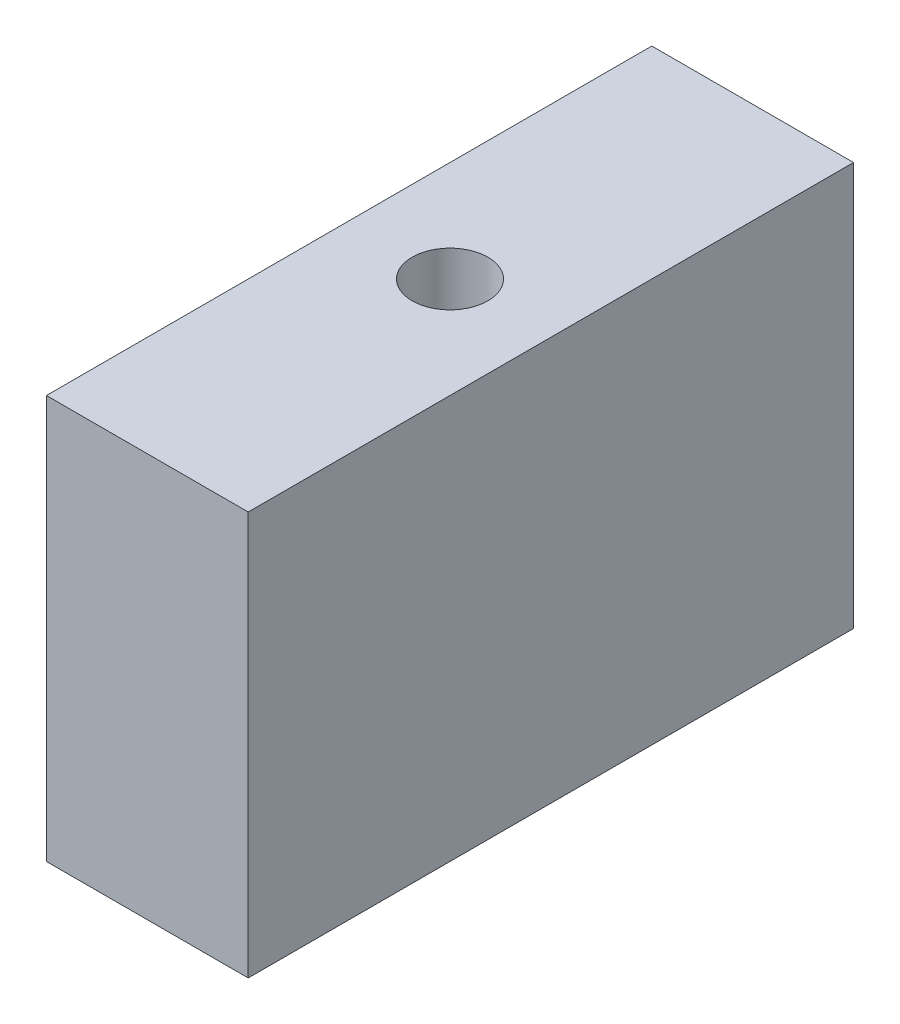
ISO-10303-21;
HEADER;
FILE_DESCRIPTION(('STEP AP214'),'2;1');
FILE_NAME('part.step','',(''),(''),'','','');
FILE_SCHEMA(('AUTOMOTIVE_DESIGN { 1 0 10303 214 1 1 1 1 }'));
ENDSEC;
DATA;
#1=APPLICATION_CONTEXT('core data for automotive mechanical design processes');
#2=APPLICATION_PROTOCOL_DEFINITION('international standard','automotive_design',2000,#1);
#3=PRODUCT_CONTEXT('',#1,'mechanical');
#4=PRODUCT('Part','Part','',(#3));
#5=PRODUCT_RELATED_PRODUCT_CATEGORY('part','',(#4));
#6=PRODUCT_DEFINITION_FORMATION('','',#4);
#7=PRODUCT_DEFINITION_CONTEXT('part definition',#1,'design');
#8=PRODUCT_DEFINITION('design','',#6,#7);
#9=PRODUCT_DEFINITION_SHAPE('','',#8);
#10=(LENGTH_UNIT() NAMED_UNIT(*) SI_UNIT(.MILLI.,.METRE.));
#11=(NAMED_UNIT(*) PLANE_ANGLE_UNIT() SI_UNIT($,.RADIAN.));
#12=(NAMED_UNIT(*) SI_UNIT($,.STERADIAN.) SOLID_ANGLE_UNIT());
#13=UNCERTAINTY_MEASURE_WITH_UNIT(LENGTH_MEASURE(1.E-05),#10,'distance_accuracy_value','');
#14=(GEOMETRIC_REPRESENTATION_CONTEXT(3) GLOBAL_UNCERTAINTY_ASSIGNED_CONTEXT((#13)) GLOBAL_UNIT_ASSIGNED_CONTEXT((#10,
#11,#12)) REPRESENTATION_CONTEXT('',''));
#15=CARTESIAN_POINT('',(0.,0.,0.));
#16=DIRECTION('',(0.,0.,1.));
#17=DIRECTION('',(1.,0.,0.));
#18=AXIS2_PLACEMENT_3D('',#15,#16,#17);
#19=CARTESIAN_POINT('',(1.5875,6.35,4.7625));
#20=DIRECTION('',(-1.,0.,0.));
#21=DIRECTION('',(0.,0.,1.));
#22=AXIS2_PLACEMENT_3D('',#19,#20,#21);
#23=PLANE('',#22);
#24=DIRECTION('',(0.,0.,-1.));
#25=VECTOR('',#24,1.);
#26=CARTESIAN_POINT('',(1.5875,0.,4.7625));
#27=LINE('',#26,#25);
#28=CARTESIAN_POINT('',(1.5875,0.,4.7625));
#29=VERTEX_POINT('',#28);
#30=CARTESIAN_POINT('',(1.5875,0.,-4.7625));
#31=VERTEX_POINT('',#30);
#32=EDGE_CURVE('E97',#29,#31,#27,.T.);
#33=ORIENTED_EDGE('',*,*,#32,.T.);
#34=DIRECTION('',(0.,-1.,0.));
#35=VECTOR('',#34,1.);
#36=CARTESIAN_POINT('',(1.5875,6.35,-4.7625));
#37=LINE('',#36,#35);
#38=CARTESIAN_POINT('',(1.5875,6.35,-4.7625));
#39=VERTEX_POINT('',#38);
#40=EDGE_CURVE('E11',#39,#31,#37,.T.);
#41=ORIENTED_EDGE('',*,*,#40,.F.);
#42=DIRECTION('',(0.,0.,-1.));
#43=VECTOR('',#42,1.);
#44=CARTESIAN_POINT('',(1.5875,6.35,4.7625));
#45=LINE('',#44,#43);
#46=CARTESIAN_POINT('',(1.5875,6.35,4.7625));
#47=VERTEX_POINT('',#46);
#48=EDGE_CURVE('E85',#47,#39,#45,.T.);
#49=ORIENTED_EDGE('',*,*,#48,.F.);
#50=DIRECTION('',(0.,-1.,0.));
#51=VECTOR('',#50,1.);
#52=CARTESIAN_POINT('',(1.5875,6.35,4.7625));
#53=LINE('',#52,#51);
#54=EDGE_CURVE('E93',#47,#29,#53,.T.);
#55=ORIENTED_EDGE('',*,*,#54,.T.);
#56=EDGE_LOOP('',(#33,#41,#49,#55));
#57=FACE_BOUND('',#56,.T.);
#58=ADVANCED_FACE('F34',(#57),#23,.F.);
#59=CARTESIAN_POINT('',(-1.5875,6.35,-4.7625));
#60=DIRECTION('',(0.,0.,1.));
#61=DIRECTION('',(1.,0.,0.));
#62=AXIS2_PLACEMENT_3D('',#59,#60,#61);
#63=PLANE('',#62);
#64=DIRECTION('',(-1.,0.,0.));
#65=VECTOR('',#64,1.);
#66=CARTESIAN_POINT('',(-1.5875,0.,-4.7625));
#67=LINE('',#66,#65);
#68=CARTESIAN_POINT('',(-1.5875,0.,-4.7625));
#69=VERTEX_POINT('',#68);
#70=EDGE_CURVE('E89',#31,#69,#67,.T.);
#71=ORIENTED_EDGE('',*,*,#70,.T.);
#72=DIRECTION('',(0.,-1.,0.));
#73=VECTOR('',#72,1.);
#74=CARTESIAN_POINT('',(-1.5875,6.35,-4.7625));
#75=LINE('',#74,#73);
#76=CARTESIAN_POINT('',(-1.5875,6.35,-4.7625));
#77=VERTEX_POINT('',#76);
#78=EDGE_CURVE('E42',#77,#69,#75,.T.);
#79=ORIENTED_EDGE('',*,*,#78,.F.);
#80=DIRECTION('',(-1.,0.,0.));
#81=VECTOR('',#80,1.);
#82=CARTESIAN_POINT('',(-1.5875,6.35,-4.7625));
#83=LINE('',#82,#81);
#84=EDGE_CURVE('E80',#39,#77,#83,.T.);
#85=ORIENTED_EDGE('',*,*,#84,.F.);
#86=ORIENTED_EDGE('',*,*,#40,.T.);
#87=EDGE_LOOP('',(#71,#79,#85,#86));
#88=FACE_BOUND('',#87,.T.);
#89=ADVANCED_FACE('F88',(#88),#63,.F.);
#90=CARTESIAN_POINT('',(-1.5875,6.35,4.7625));
#91=DIRECTION('',(1.,0.,0.));
#92=DIRECTION('',(0.,0.,-1.));
#93=AXIS2_PLACEMENT_3D('',#90,#91,#92);
#94=PLANE('',#93);
#95=DIRECTION('',(0.,0.,1.));
#96=VECTOR('',#95,1.);
#97=CARTESIAN_POINT('',(-1.5875,0.,4.7625));
#98=LINE('',#97,#96);
#99=CARTESIAN_POINT('',(-1.5875,0.,4.7625));
#100=VERTEX_POINT('',#99);
#101=EDGE_CURVE('E67',#69,#100,#98,.T.);
#102=ORIENTED_EDGE('',*,*,#101,.T.);
#103=DIRECTION('',(0.,-1.,0.));
#104=VECTOR('',#103,1.);
#105=CARTESIAN_POINT('',(-1.5875,6.35,4.7625));
#106=LINE('',#105,#104);
#107=CARTESIAN_POINT('',(-1.5875,6.35,4.7625));
#108=VERTEX_POINT('',#107);
#109=EDGE_CURVE('E90',#108,#100,#106,.T.);
#110=ORIENTED_EDGE('',*,*,#109,.F.);
#111=DIRECTION('',(0.,0.,1.));
#112=VECTOR('',#111,1.);
#113=CARTESIAN_POINT('',(-1.5875,6.35,4.7625));
#114=LINE('',#113,#112);
#115=EDGE_CURVE('E83',#77,#108,#114,.T.);
#116=ORIENTED_EDGE('',*,*,#115,.F.);
#117=ORIENTED_EDGE('',*,*,#78,.T.);
#118=EDGE_LOOP('',(#102,#110,#116,#117));
#119=FACE_BOUND('',#118,.T.);
#120=ADVANCED_FACE('F91',(#119),#94,.F.);
#121=CARTESIAN_POINT('',(-1.5875,6.35,4.7625));
#122=DIRECTION('',(0.,0.,-1.));
#123=DIRECTION('',(-1.,0.,0.));
#124=AXIS2_PLACEMENT_3D('',#121,#122,#123);
#125=PLANE('',#124);
#126=DIRECTION('',(1.,0.,0.));
#127=VECTOR('',#126,1.);
#128=CARTESIAN_POINT('',(-1.5875,0.,4.7625));
#129=LINE('',#128,#127);
#130=EDGE_CURVE('E73',#100,#29,#129,.T.);
#131=ORIENTED_EDGE('',*,*,#130,.T.);
#132=ORIENTED_EDGE('',*,*,#54,.F.);
#133=DIRECTION('',(1.,0.,0.));
#134=VECTOR('',#133,1.);
#135=CARTESIAN_POINT('',(-1.5875,6.35,4.7625));
#136=LINE('',#135,#134);
#137=EDGE_CURVE('E50',#108,#47,#136,.T.);
#138=ORIENTED_EDGE('',*,*,#137,.F.);
#139=ORIENTED_EDGE('',*,*,#109,.T.);
#140=EDGE_LOOP('',(#131,#132,#138,#139));
#141=FACE_BOUND('',#140,.T.);
#142=ADVANCED_FACE('F105',(#141),#125,.F.);
#143=CARTESIAN_POINT('',(0.,6.35,0.));
#144=DIRECTION('',(0.,-1.,0.));
#145=DIRECTION('',(0.,0.,-1.));
#146=AXIS2_PLACEMENT_3D('',#143,#144,#145);
#147=PLANE('',#146);
#148=CARTESIAN_POINT('',(0.,6.35,0.));
#149=DIRECTION('',(0.,1.,0.));
#150=DIRECTION('',(0.,0.,1.));
#151=AXIS2_PLACEMENT_3D('',#148,#149,#150);
#152=CIRCLE('',#151,0.595629999999988);
#153=CARTESIAN_POINT('',(0.,6.35,0.595629999999988));
#154=VERTEX_POINT('',#153);
#155=EDGE_CURVE('E113',#154,#154,#152,.T.);
#156=ORIENTED_EDGE('',*,*,#155,.F.);
#157=EDGE_LOOP('',(#156));
#158=FACE_BOUND('',#157,.T.);
#159=ORIENTED_EDGE('',*,*,#48,.T.);
#160=ORIENTED_EDGE('',*,*,#84,.T.);
#161=ORIENTED_EDGE('',*,*,#115,.T.);
#162=ORIENTED_EDGE('',*,*,#137,.T.);
#163=EDGE_LOOP('',(#159,#160,#161,#162));
#164=FACE_BOUND('',#163,.T.);
#165=ADVANCED_FACE('F81',(#158,#164),#147,.F.);
#166=CARTESIAN_POINT('',(0.,0.,0.));
#167=DIRECTION('',(0.,-1.,0.));
#168=DIRECTION('',(0.,0.,-1.));
#169=AXIS2_PLACEMENT_3D('',#166,#167,#168);
#170=PLANE('',#169);
#171=CARTESIAN_POINT('',(0.,0.,0.));
#172=DIRECTION('',(0.,1.,0.));
#173=DIRECTION('',(0.,0.,1.));
#174=AXIS2_PLACEMENT_3D('',#171,#172,#173);
#175=CIRCLE('',#174,0.595629999999998);
#176=CARTESIAN_POINT('',(0.,0.,0.595629999999998));
#177=VERTEX_POINT('',#176);
#178=EDGE_CURVE('E100',#177,#177,#175,.T.);
#179=ORIENTED_EDGE('',*,*,#178,.T.);
#180=EDGE_LOOP('',(#179));
#181=FACE_BOUND('',#180,.T.);
#182=ORIENTED_EDGE('',*,*,#32,.F.);
#183=ORIENTED_EDGE('',*,*,#130,.F.);
#184=ORIENTED_EDGE('',*,*,#101,.F.);
#185=ORIENTED_EDGE('',*,*,#70,.F.);
#186=EDGE_LOOP('',(#182,#183,#184,#185));
#187=FACE_BOUND('',#186,.T.);
#188=ADVANCED_FACE('F108',(#181,#187),#170,.T.);
#189=CARTESIAN_POINT('',(0.,6.35,0.));
#190=DIRECTION('',(0.,1.,0.));
#191=DIRECTION('',(0.,0.,1.));
#192=AXIS2_PLACEMENT_3D('',#189,#190,#191);
#193=CYLINDRICAL_SURFACE('',#192,0.595629999999993);
#194=ORIENTED_EDGE('',*,*,#178,.F.);
#195=EDGE_LOOP('',(#194));
#196=FACE_BOUND('',#195,.T.);
#197=ORIENTED_EDGE('',*,*,#155,.T.);
#198=EDGE_LOOP('',(#197));
#199=FACE_BOUND('',#198,.T.);
#200=ADVANCED_FACE('F117',(#196,#199),#193,.F.);
#201=CLOSED_SHELL('',(#58,#89,#120,#142,#165,#188,#200));
#202=MANIFOLD_SOLID_BREP('B2',#201);
#203=ADVANCED_BREP_SHAPE_REPRESENTATION('',(#18,#202),#14);
#204=SHAPE_DEFINITION_REPRESENTATION(#9,#203);
ENDSEC;
END-ISO-10303-21;
